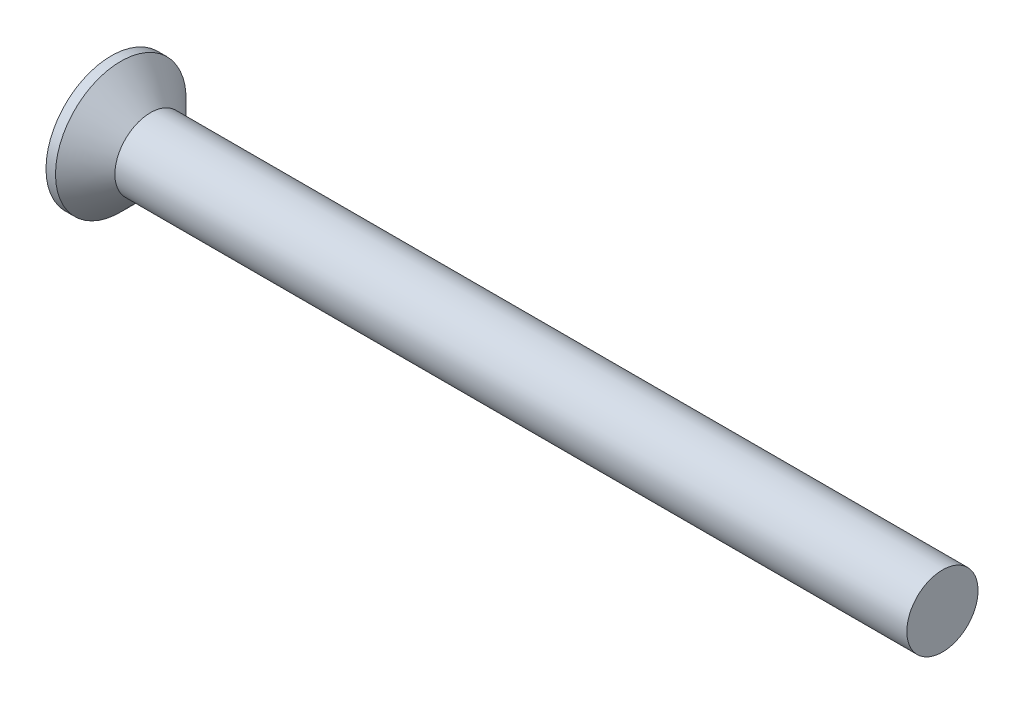
ISO-10303-21;
HEADER;
FILE_DESCRIPTION(('STEP AP214'),'2;1');
FILE_NAME('part.step','',(''),(''),'','','');
FILE_SCHEMA(('AUTOMOTIVE_DESIGN { 1 0 10303 214 1 1 1 1 }'));
ENDSEC;
DATA;
#1=APPLICATION_CONTEXT('core data for automotive mechanical design processes');
#2=APPLICATION_PROTOCOL_DEFINITION('international standard','automotive_design',2000,#1);
#3=PRODUCT_CONTEXT('',#1,'mechanical');
#4=PRODUCT('Part','Part','',(#3));
#5=PRODUCT_RELATED_PRODUCT_CATEGORY('part','',(#4));
#6=PRODUCT_DEFINITION_FORMATION('','',#4);
#7=PRODUCT_DEFINITION_CONTEXT('part definition',#1,'design');
#8=PRODUCT_DEFINITION('design','',#6,#7);
#9=PRODUCT_DEFINITION_SHAPE('','',#8);
#10=(LENGTH_UNIT() NAMED_UNIT(*) SI_UNIT(.MILLI.,.METRE.));
#11=(NAMED_UNIT(*) PLANE_ANGLE_UNIT() SI_UNIT($,.RADIAN.));
#12=(NAMED_UNIT(*) SI_UNIT($,.STERADIAN.) SOLID_ANGLE_UNIT());
#13=UNCERTAINTY_MEASURE_WITH_UNIT(LENGTH_MEASURE(1.E-05),#10,'distance_accuracy_value','');
#14=(GEOMETRIC_REPRESENTATION_CONTEXT(3) GLOBAL_UNCERTAINTY_ASSIGNED_CONTEXT((#13)) GLOBAL_UNIT_ASSIGNED_CONTEXT((#10,
#11,#12)) REPRESENTATION_CONTEXT('',''));
#15=CARTESIAN_POINT('',(0.,0.,0.));
#16=DIRECTION('',(0.,0.,1.));
#17=DIRECTION('',(1.,0.,0.));
#18=AXIS2_PLACEMENT_3D('',#15,#16,#17);
#19=CARTESIAN_POINT('',(0.,2.75,0.));
#20=DIRECTION('',(1.,0.,0.));
#21=DIRECTION('',(0.,0.,-1.));
#22=AXIS2_PLACEMENT_3D('',#19,#20,#21);
#23=PLANE('',#22);
#24=CARTESIAN_POINT('',(0.,0.,0.));
#25=DIRECTION('',(-1.,0.,0.));
#26=DIRECTION('',(0.,0.,1.));
#27=AXIS2_PLACEMENT_3D('',#24,#25,#26);
#28=CIRCLE('',#27,2.75);
#29=CARTESIAN_POINT('',(0.,0.,2.75));
#30=VERTEX_POINT('',#29);
#31=EDGE_CURVE('E45',#30,#30,#28,.T.);
#32=ORIENTED_EDGE('',*,*,#31,.T.);
#33=EDGE_LOOP('',(#32));
#34=FACE_BOUND('',#33,.T.);
#35=ADVANCED_FACE('F31',(#34),#23,.F.);
#36=CARTESIAN_POINT('',(35.,0.,0.));
#37=DIRECTION('',(-1.,0.,0.));
#38=DIRECTION('',(0.,0.,1.));
#39=AXIS2_PLACEMENT_3D('',#36,#37,#38);
#40=PLANE('',#39);
#41=CARTESIAN_POINT('',(35.,0.,0.));
#42=DIRECTION('',(-1.,0.,0.));
#43=DIRECTION('',(0.,0.,1.));
#44=AXIS2_PLACEMENT_3D('',#41,#42,#43);
#45=CIRCLE('',#44,1.5);
#46=CARTESIAN_POINT('',(35.,0.,1.5));
#47=VERTEX_POINT('',#46);
#48=EDGE_CURVE('E10',#47,#47,#45,.T.);
#49=ORIENTED_EDGE('',*,*,#48,.F.);
#50=EDGE_LOOP('',(#49));
#51=FACE_BOUND('',#50,.T.);
#52=ADVANCED_FACE('F65',(#51),#40,.F.);
#53=CARTESIAN_POINT('',(0.,0.,0.));
#54=DIRECTION('',(-1.,0.,0.));
#55=DIRECTION('',(0.,0.,1.));
#56=AXIS2_PLACEMENT_3D('',#53,#54,#55);
#57=CYLINDRICAL_SURFACE('',#56,1.5);
#58=CARTESIAN_POINT('',(1.65,0.,0.));
#59=DIRECTION('',(-1.,0.,0.));
#60=DIRECTION('',(0.,0.,1.));
#61=AXIS2_PLACEMENT_3D('',#58,#59,#60);
#62=CIRCLE('',#61,1.5);
#63=CARTESIAN_POINT('',(1.65,0.,1.5));
#64=VERTEX_POINT('',#63);
#65=EDGE_CURVE('E37',#64,#64,#62,.T.);
#66=ORIENTED_EDGE('',*,*,#65,.F.);
#67=EDGE_LOOP('',(#66));
#68=FACE_BOUND('',#67,.T.);
#69=ORIENTED_EDGE('',*,*,#48,.T.);
#70=EDGE_LOOP('',(#69));
#71=FACE_BOUND('',#70,.T.);
#72=ADVANCED_FACE('F60',(#68,#71),#57,.T.);
#73=CARTESIAN_POINT('',(1.65,0.,0.));
#74=DIRECTION('',(-1.,0.,0.));
#75=DIRECTION('',(0.,0.,1.));
#76=AXIS2_PLACEMENT_3D('',#73,#74,#75);
#77=CONICAL_SURFACE('',#76,1.5,0.78539816339745);
#78=CARTESIAN_POINT('',(0.400000000000003,0.,0.));
#79=DIRECTION('',(-1.,0.,0.));
#80=DIRECTION('',(0.,0.,1.));
#81=AXIS2_PLACEMENT_3D('',#78,#79,#80);
#82=CIRCLE('',#81,2.75);
#83=CARTESIAN_POINT('',(0.400000000000003,0.,2.75));
#84=VERTEX_POINT('',#83);
#85=EDGE_CURVE('E41',#84,#84,#82,.T.);
#86=ORIENTED_EDGE('',*,*,#85,.F.);
#87=EDGE_LOOP('',(#86));
#88=FACE_BOUND('',#87,.T.);
#89=ORIENTED_EDGE('',*,*,#65,.T.);
#90=EDGE_LOOP('',(#89));
#91=FACE_BOUND('',#90,.T.);
#92=ADVANCED_FACE('F55',(#88,#91),#77,.T.);
#93=CARTESIAN_POINT('',(0.,0.,0.));
#94=DIRECTION('',(-1.,0.,0.));
#95=DIRECTION('',(0.,0.,1.));
#96=AXIS2_PLACEMENT_3D('',#93,#94,#95);
#97=CYLINDRICAL_SURFACE('',#96,2.75);
#98=ORIENTED_EDGE('',*,*,#31,.F.);
#99=EDGE_LOOP('',(#98));
#100=FACE_BOUND('',#99,.T.);
#101=ORIENTED_EDGE('',*,*,#85,.T.);
#102=EDGE_LOOP('',(#101));
#103=FACE_BOUND('',#102,.T.);
#104=ADVANCED_FACE('F52',(#100,#103),#97,.T.);
#105=CLOSED_SHELL('',(#35,#52,#72,#92,#104));
#106=MANIFOLD_SOLID_BREP('B2',#105);
#107=ADVANCED_BREP_SHAPE_REPRESENTATION('',(#18,#106),#14);
#108=SHAPE_DEFINITION_REPRESENTATION(#9,#107);
ENDSEC;
END-ISO-10303-21;
